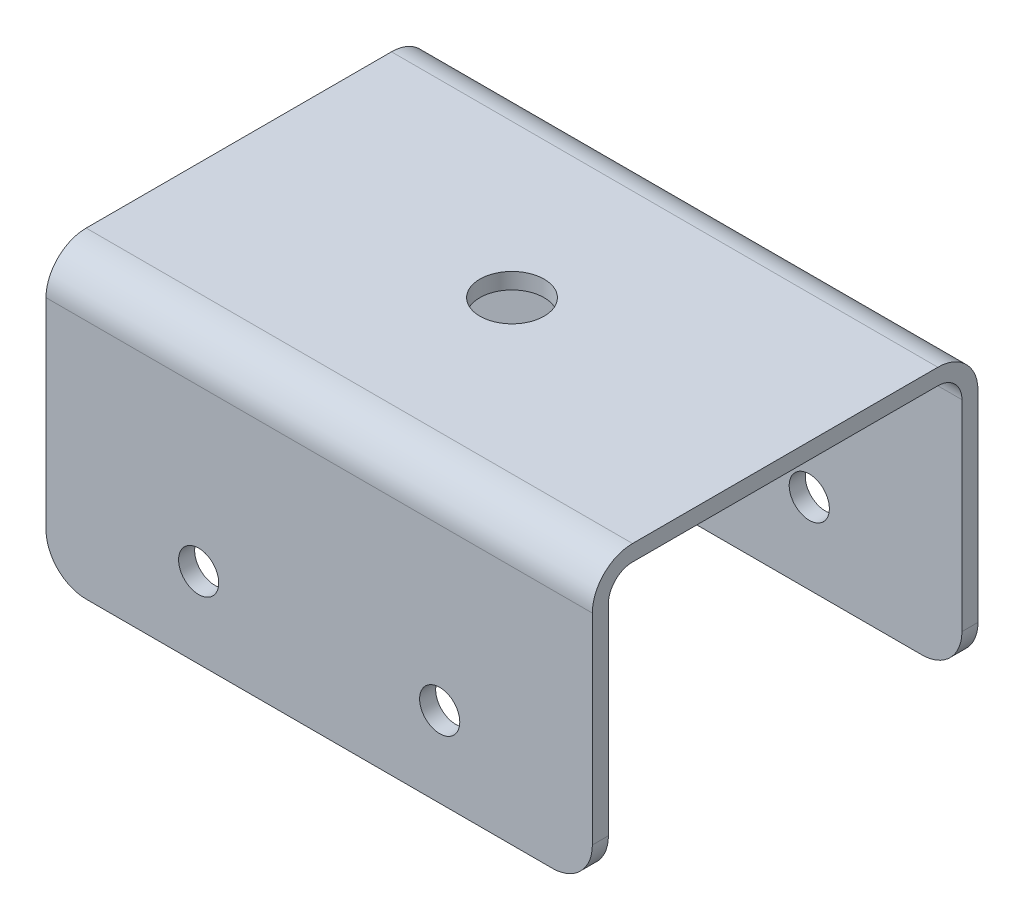
ISO-10303-21;
HEADER;
FILE_DESCRIPTION(('STEP AP214'),'2;1');
FILE_NAME('part.step','',(''),(''),'','','');
FILE_SCHEMA(('AUTOMOTIVE_DESIGN { 1 0 10303 214 1 1 1 1 }'));
ENDSEC;
DATA;
#1=APPLICATION_CONTEXT('core data for automotive mechanical design processes');
#2=APPLICATION_PROTOCOL_DEFINITION('international standard','automotive_design',2000,#1);
#3=PRODUCT_CONTEXT('',#1,'mechanical');
#4=PRODUCT('Part','Part','',(#3));
#5=PRODUCT_RELATED_PRODUCT_CATEGORY('part','',(#4));
#6=PRODUCT_DEFINITION_FORMATION('','',#4);
#7=PRODUCT_DEFINITION_CONTEXT('part definition',#1,'design');
#8=PRODUCT_DEFINITION('design','',#6,#7);
#9=PRODUCT_DEFINITION_SHAPE('','',#8);
#10=(LENGTH_UNIT() NAMED_UNIT(*) SI_UNIT(.MILLI.,.METRE.));
#11=(NAMED_UNIT(*) PLANE_ANGLE_UNIT() SI_UNIT($,.RADIAN.));
#12=(NAMED_UNIT(*) SI_UNIT($,.STERADIAN.) SOLID_ANGLE_UNIT());
#13=UNCERTAINTY_MEASURE_WITH_UNIT(LENGTH_MEASURE(1.E-05),#10,'distance_accuracy_value','');
#14=(GEOMETRIC_REPRESENTATION_CONTEXT(3) GLOBAL_UNCERTAINTY_ASSIGNED_CONTEXT((#13)) GLOBAL_UNIT_ASSIGNED_CONTEXT((#10,
#11,#12)) REPRESENTATION_CONTEXT('',''));
#15=CARTESIAN_POINT('',(0.,0.,0.));
#16=DIRECTION('',(0.,0.,1.));
#17=DIRECTION('',(1.,0.,0.));
#18=AXIS2_PLACEMENT_3D('',#15,#16,#17);
#19=CARTESIAN_POINT('',(34.,35.,-24.));
#20=DIRECTION('',(-1.,0.,0.));
#21=DIRECTION('',(0.,0.,1.));
#22=AXIS2_PLACEMENT_3D('',#19,#20,#21);
#23=PLANE('',#22);
#24=DIRECTION('',(0.,-1.,0.));
#25=VECTOR('',#24,1.);
#26=CARTESIAN_POINT('',(34.,0.,-22.));
#27=LINE('',#26,#25);
#28=CARTESIAN_POINT('',(34.,30.,-22.));
#29=VERTEX_POINT('',#28);
#30=CARTESIAN_POINT('',(34.,5.,-22.));
#31=VERTEX_POINT('',#30);
#32=EDGE_CURVE('E187',#29,#31,#27,.T.);
#33=ORIENTED_EDGE('',*,*,#32,.T.);
#34=DIRECTION('',(0.,0.,-1.));
#35=VECTOR('',#34,1.);
#36=CARTESIAN_POINT('',(34.,5.,-24.));
#37=LINE('',#36,#35);
#38=CARTESIAN_POINT('',(34.,5.,-24.));
#39=VERTEX_POINT('',#38);
#40=EDGE_CURVE('E257',#31,#39,#37,.T.);
#41=ORIENTED_EDGE('',*,*,#40,.T.);
#42=DIRECTION('',(0.,-1.,0.));
#43=VECTOR('',#42,1.);
#44=CARTESIAN_POINT('',(34.,35.,-24.));
#45=LINE('',#44,#43);
#46=CARTESIAN_POINT('',(34.,30.,-24.));
#47=VERTEX_POINT('',#46);
#48=EDGE_CURVE('E222',#47,#39,#45,.T.);
#49=ORIENTED_EDGE('',*,*,#48,.F.);
#50=CARTESIAN_POINT('',(34.,30.,-19.));
#51=DIRECTION('',(-1.,0.,0.));
#52=DIRECTION('',(0.,0.,1.));
#53=AXIS2_PLACEMENT_3D('',#50,#51,#52);
#54=CIRCLE('',#53,5.);
#55=CARTESIAN_POINT('',(34.,35.,-19.));
#56=VERTEX_POINT('',#55);
#57=EDGE_CURVE('E239',#47,#56,#54,.F.);
#58=ORIENTED_EDGE('',*,*,#57,.T.);
#59=DIRECTION('',(0.,0.,-1.));
#60=VECTOR('',#59,1.);
#61=CARTESIAN_POINT('',(34.,35.,-24.));
#62=LINE('',#61,#60);
#63=CARTESIAN_POINT('',(34.,35.,19.));
#64=VERTEX_POINT('',#63);
#65=EDGE_CURVE('E203',#64,#56,#62,.T.);
#66=ORIENTED_EDGE('',*,*,#65,.F.);
#67=CARTESIAN_POINT('',(34.,30.,19.));
#68=DIRECTION('',(-1.,0.,0.));
#69=DIRECTION('',(0.,0.,1.));
#70=AXIS2_PLACEMENT_3D('',#67,#68,#69);
#71=CIRCLE('',#70,5.);
#72=CARTESIAN_POINT('',(34.,30.,24.));
#73=VERTEX_POINT('',#72);
#74=EDGE_CURVE('E237',#64,#73,#71,.F.);
#75=ORIENTED_EDGE('',*,*,#74,.T.);
#76=DIRECTION('',(0.,-1.,0.));
#77=VECTOR('',#76,1.);
#78=CARTESIAN_POINT('',(34.,35.,24.));
#79=LINE('',#78,#77);
#80=CARTESIAN_POINT('',(34.,5.,24.));
#81=VERTEX_POINT('',#80);
#82=EDGE_CURVE('E210',#73,#81,#79,.T.);
#83=ORIENTED_EDGE('',*,*,#82,.T.);
#84=DIRECTION('',(0.,0.,-1.));
#85=VECTOR('',#84,1.);
#86=CARTESIAN_POINT('',(34.,5.,-24.));
#87=LINE('',#86,#85);
#88=CARTESIAN_POINT('',(34.,5.,22.));
#89=VERTEX_POINT('',#88);
#90=EDGE_CURVE('E247',#81,#89,#87,.T.);
#91=ORIENTED_EDGE('',*,*,#90,.T.);
#92=DIRECTION('',(0.,1.,0.));
#93=VECTOR('',#92,1.);
#94=CARTESIAN_POINT('',(34.,30.,22.));
#95=LINE('',#94,#93);
#96=CARTESIAN_POINT('',(34.,30.,22.));
#97=VERTEX_POINT('',#96);
#98=EDGE_CURVE('E175',#89,#97,#95,.T.);
#99=ORIENTED_EDGE('',*,*,#98,.T.);
#100=CARTESIAN_POINT('',(34.,30.,19.));
#101=DIRECTION('',(-1.,0.,0.));
#102=DIRECTION('',(0.,0.,1.));
#103=AXIS2_PLACEMENT_3D('',#100,#101,#102);
#104=CIRCLE('',#103,3.);
#105=CARTESIAN_POINT('',(34.,33.,19.));
#106=VERTEX_POINT('',#105);
#107=EDGE_CURVE('E155',#97,#106,#104,.T.);
#108=ORIENTED_EDGE('',*,*,#107,.T.);
#109=DIRECTION('',(0.,0.,-1.));
#110=VECTOR('',#109,1.);
#111=CARTESIAN_POINT('',(34.,33.,-19.));
#112=LINE('',#111,#110);
#113=CARTESIAN_POINT('',(34.,33.,-19.));
#114=VERTEX_POINT('',#113);
#115=EDGE_CURVE('E165',#106,#114,#112,.T.);
#116=ORIENTED_EDGE('',*,*,#115,.T.);
#117=CARTESIAN_POINT('',(34.,30.,-19.));
#118=DIRECTION('',(-1.,0.,0.));
#119=DIRECTION('',(0.,0.,1.));
#120=AXIS2_PLACEMENT_3D('',#117,#118,#119);
#121=CIRCLE('',#120,3.);
#122=EDGE_CURVE('E170',#114,#29,#121,.T.);
#123=ORIENTED_EDGE('',*,*,#122,.T.);
#124=EDGE_LOOP('',(#33,#41,#49,#58,#66,#75,#83,#91,#99,#108,#116,#123));
#125=FACE_BOUND('',#124,.T.);
#126=ADVANCED_FACE('F33',(#125),#23,.F.);
#127=CARTESIAN_POINT('',(0.,0.,0.));
#128=DIRECTION('',(0.,1.,0.));
#129=DIRECTION('',(0.,0.,1.));
#130=AXIS2_PLACEMENT_3D('',#127,#128,#129);
#131=PLANE('',#130);
#132=DIRECTION('',(-1.,0.,0.));
#133=VECTOR('',#132,1.);
#134=CARTESIAN_POINT('',(-34.,0.,-24.));
#135=LINE('',#134,#133);
#136=CARTESIAN_POINT('',(29.,0.,-24.));
#137=VERTEX_POINT('',#136);
#138=CARTESIAN_POINT('',(-29.,0.,-24.));
#139=VERTEX_POINT('',#138);
#140=EDGE_CURVE('E200',#137,#139,#135,.T.);
#141=ORIENTED_EDGE('',*,*,#140,.F.);
#142=DIRECTION('',(0.,0.,-1.));
#143=VECTOR('',#142,1.);
#144=CARTESIAN_POINT('',(29.,0.,0.));
#145=LINE('',#144,#143);
#146=CARTESIAN_POINT('',(29.,0.,-22.));
#147=VERTEX_POINT('',#146);
#148=EDGE_CURVE('E266',#137,#147,#145,.F.);
#149=ORIENTED_EDGE('',*,*,#148,.T.);
#150=DIRECTION('',(-1.,0.,0.));
#151=VECTOR('',#150,1.);
#152=CARTESIAN_POINT('',(-34.,0.,-22.));
#153=LINE('',#152,#151);
#154=CARTESIAN_POINT('',(-29.,0.,-22.));
#155=VERTEX_POINT('',#154);
#156=EDGE_CURVE('E190',#147,#155,#153,.T.);
#157=ORIENTED_EDGE('',*,*,#156,.T.);
#158=DIRECTION('',(0.,0.,1.));
#159=VECTOR('',#158,1.);
#160=CARTESIAN_POINT('',(-29.,0.,0.));
#161=LINE('',#160,#159);
#162=EDGE_CURVE('E264',#155,#139,#161,.F.);
#163=ORIENTED_EDGE('',*,*,#162,.T.);
#164=EDGE_LOOP('',(#141,#149,#157,#163));
#165=FACE_BOUND('',#164,.T.);
#166=ADVANCED_FACE('F328',(#165),#131,.F.);
#167=DIRECTION('',(1.,0.,0.));
#168=VECTOR('',#167,1.);
#169=CARTESIAN_POINT('',(-34.,0.,22.));
#170=LINE('',#169,#168);
#171=CARTESIAN_POINT('',(-29.,0.,22.));
#172=VERTEX_POINT('',#171);
#173=CARTESIAN_POINT('',(29.,0.,22.));
#174=VERTEX_POINT('',#173);
#175=EDGE_CURVE('E198',#172,#174,#170,.T.);
#176=ORIENTED_EDGE('',*,*,#175,.T.);
#177=DIRECTION('',(0.,0.,-1.));
#178=VECTOR('',#177,1.);
#179=CARTESIAN_POINT('',(29.,0.,0.));
#180=LINE('',#179,#178);
#181=CARTESIAN_POINT('',(29.,0.,24.));
#182=VERTEX_POINT('',#181);
#183=EDGE_CURVE('E57',#174,#182,#180,.F.);
#184=ORIENTED_EDGE('',*,*,#183,.T.);
#185=DIRECTION('',(1.,0.,0.));
#186=VECTOR('',#185,1.);
#187=CARTESIAN_POINT('',(-34.,0.,24.));
#188=LINE('',#187,#186);
#189=CARTESIAN_POINT('',(-29.,0.,24.));
#190=VERTEX_POINT('',#189);
#191=EDGE_CURVE('E207',#190,#182,#188,.T.);
#192=ORIENTED_EDGE('',*,*,#191,.F.);
#193=DIRECTION('',(0.,0.,1.));
#194=VECTOR('',#193,1.);
#195=CARTESIAN_POINT('',(-29.,0.,0.));
#196=LINE('',#195,#194);
#197=EDGE_CURVE('E276',#190,#172,#196,.F.);
#198=ORIENTED_EDGE('',*,*,#197,.T.);
#199=EDGE_LOOP('',(#176,#184,#192,#198));
#200=FACE_BOUND('',#199,.T.);
#201=ADVANCED_FACE('F330',(#200),#131,.F.);
#202=CARTESIAN_POINT('',(-34.,35.,-24.));
#203=DIRECTION('',(0.,0.,1.));
#204=DIRECTION('',(1.,0.,0.));
#205=AXIS2_PLACEMENT_3D('',#202,#203,#204);
#206=PLANE('',#205);
#207=CARTESIAN_POINT('',(-15.,10.,-24.));
#208=DIRECTION('',(0.,0.,1.));
#209=DIRECTION('',(1.,0.,0.));
#210=AXIS2_PLACEMENT_3D('',#207,#208,#209);
#211=CIRCLE('',#210,2.5);
#212=CARTESIAN_POINT('',(-12.5,10.,-24.));
#213=VERTEX_POINT('',#212);
#214=EDGE_CURVE('E252',#213,#213,#211,.T.);
#215=ORIENTED_EDGE('',*,*,#214,.T.);
#216=EDGE_LOOP('',(#215));
#217=FACE_BOUND('',#216,.T.);
#218=CARTESIAN_POINT('',(15.,10.,-24.));
#219=DIRECTION('',(0.,0.,1.));
#220=DIRECTION('',(1.,0.,0.));
#221=AXIS2_PLACEMENT_3D('',#218,#219,#220);
#222=CIRCLE('',#221,2.5);
#223=CARTESIAN_POINT('',(17.5,10.,-24.));
#224=VERTEX_POINT('',#223);
#225=EDGE_CURVE('E416',#224,#224,#222,.T.);
#226=ORIENTED_EDGE('',*,*,#225,.T.);
#227=EDGE_LOOP('',(#226));
#228=FACE_BOUND('',#227,.T.);
#229=ORIENTED_EDGE('',*,*,#48,.T.);
#230=CARTESIAN_POINT('',(29.,5.,-24.));
#231=DIRECTION('',(0.,0.,1.));
#232=DIRECTION('',(1.,0.,0.));
#233=AXIS2_PLACEMENT_3D('',#230,#231,#232);
#234=CIRCLE('',#233,5.);
#235=EDGE_CURVE('E262',#39,#137,#234,.F.);
#236=ORIENTED_EDGE('',*,*,#235,.T.);
#237=ORIENTED_EDGE('',*,*,#140,.T.);
#238=CARTESIAN_POINT('',(-29.,5.,-24.));
#239=DIRECTION('',(0.,0.,1.));
#240=DIRECTION('',(1.,0.,0.));
#241=AXIS2_PLACEMENT_3D('',#238,#239,#240);
#242=CIRCLE('',#241,5.);
#243=CARTESIAN_POINT('',(-34.,5.,-24.));
#244=VERTEX_POINT('',#243);
#245=EDGE_CURVE('E260',#139,#244,#242,.F.);
#246=ORIENTED_EDGE('',*,*,#245,.T.);
#247=DIRECTION('',(0.,-1.,0.));
#248=VECTOR('',#247,1.);
#249=CARTESIAN_POINT('',(-34.,35.,-24.));
#250=LINE('',#249,#248);
#251=CARTESIAN_POINT('',(-34.,30.,-24.));
#252=VERTEX_POINT('',#251);
#253=EDGE_CURVE('E219',#252,#244,#250,.T.);
#254=ORIENTED_EDGE('',*,*,#253,.F.);
#255=DIRECTION('',(-1.,0.,0.));
#256=VECTOR('',#255,1.);
#257=CARTESIAN_POINT('',(34.,30.,-24.));
#258=LINE('',#257,#256);
#259=EDGE_CURVE('E235',#252,#47,#258,.F.);
#260=ORIENTED_EDGE('',*,*,#259,.T.);
#261=EDGE_LOOP('',(#229,#236,#237,#246,#254,#260));
#262=FACE_BOUND('',#261,.T.);
#263=ADVANCED_FACE('F307',(#217,#228,#262),#206,.F.);
#264=CARTESIAN_POINT('',(-34.,35.,-24.));
#265=DIRECTION('',(1.,0.,0.));
#266=DIRECTION('',(0.,0.,-1.));
#267=AXIS2_PLACEMENT_3D('',#264,#265,#266);
#268=PLANE('',#267);
#269=ORIENTED_EDGE('',*,*,#253,.T.);
#270=DIRECTION('',(0.,0.,1.));
#271=VECTOR('',#270,1.);
#272=CARTESIAN_POINT('',(-34.,5.,-24.));
#273=LINE('',#272,#271);
#274=CARTESIAN_POINT('',(-34.,5.,-22.));
#275=VERTEX_POINT('',#274);
#276=EDGE_CURVE('E11',#244,#275,#273,.T.);
#277=ORIENTED_EDGE('',*,*,#276,.T.);
#278=DIRECTION('',(0.,-1.,0.));
#279=VECTOR('',#278,1.);
#280=CARTESIAN_POINT('',(-34.,0.,-22.));
#281=LINE('',#280,#279);
#282=CARTESIAN_POINT('',(-34.,30.,-22.));
#283=VERTEX_POINT('',#282);
#284=EDGE_CURVE('E177',#283,#275,#281,.T.);
#285=ORIENTED_EDGE('',*,*,#284,.F.);
#286=CARTESIAN_POINT('',(-34.,30.,-19.));
#287=DIRECTION('',(1.,0.,0.));
#288=DIRECTION('',(0.,0.,-1.));
#289=AXIS2_PLACEMENT_3D('',#286,#287,#288);
#290=CIRCLE('',#289,3.);
#291=CARTESIAN_POINT('',(-34.,33.,-19.));
#292=VERTEX_POINT('',#291);
#293=EDGE_CURVE('E191',#292,#283,#290,.F.);
#294=ORIENTED_EDGE('',*,*,#293,.F.);
#295=DIRECTION('',(0.,0.,-1.));
#296=VECTOR('',#295,1.);
#297=CARTESIAN_POINT('',(-34.,33.,-19.));
#298=LINE('',#297,#296);
#299=CARTESIAN_POINT('',(-34.,33.,19.));
#300=VERTEX_POINT('',#299);
#301=EDGE_CURVE('E194',#300,#292,#298,.T.);
#302=ORIENTED_EDGE('',*,*,#301,.F.);
#303=CARTESIAN_POINT('',(-34.,30.,19.));
#304=DIRECTION('',(1.,0.,0.));
#305=DIRECTION('',(0.,0.,-1.));
#306=AXIS2_PLACEMENT_3D('',#303,#304,#305);
#307=CIRCLE('',#306,3.);
#308=CARTESIAN_POINT('',(-34.,30.,22.));
#309=VERTEX_POINT('',#308);
#310=EDGE_CURVE('E157',#309,#300,#307,.F.);
#311=ORIENTED_EDGE('',*,*,#310,.F.);
#312=DIRECTION('',(0.,1.,0.));
#313=VECTOR('',#312,1.);
#314=CARTESIAN_POINT('',(-34.,30.,22.));
#315=LINE('',#314,#313);
#316=CARTESIAN_POINT('',(-34.,5.,22.));
#317=VERTEX_POINT('',#316);
#318=EDGE_CURVE('E180',#317,#309,#315,.T.);
#319=ORIENTED_EDGE('',*,*,#318,.F.);
#320=DIRECTION('',(0.,0.,1.));
#321=VECTOR('',#320,1.);
#322=CARTESIAN_POINT('',(-34.,5.,-24.));
#323=LINE('',#322,#321);
#324=CARTESIAN_POINT('',(-34.,5.,24.));
#325=VERTEX_POINT('',#324);
#326=EDGE_CURVE('E42',#317,#325,#323,.T.);
#327=ORIENTED_EDGE('',*,*,#326,.T.);
#328=DIRECTION('',(0.,-1.,0.));
#329=VECTOR('',#328,1.);
#330=CARTESIAN_POINT('',(-34.,35.,24.));
#331=LINE('',#330,#329);
#332=CARTESIAN_POINT('',(-34.,30.,24.));
#333=VERTEX_POINT('',#332);
#334=EDGE_CURVE('E216',#333,#325,#331,.T.);
#335=ORIENTED_EDGE('',*,*,#334,.F.);
#336=CARTESIAN_POINT('',(-34.,30.,19.));
#337=DIRECTION('',(1.,0.,0.));
#338=DIRECTION('',(0.,0.,-1.));
#339=AXIS2_PLACEMENT_3D('',#336,#337,#338);
#340=CIRCLE('',#339,5.);
#341=CARTESIAN_POINT('',(-34.,35.,19.));
#342=VERTEX_POINT('',#341);
#343=EDGE_CURVE('E231',#333,#342,#340,.F.);
#344=ORIENTED_EDGE('',*,*,#343,.T.);
#345=DIRECTION('',(0.,0.,1.));
#346=VECTOR('',#345,1.);
#347=CARTESIAN_POINT('',(-34.,35.,-24.));
#348=LINE('',#347,#346);
#349=CARTESIAN_POINT('',(-34.,35.,-19.));
#350=VERTEX_POINT('',#349);
#351=EDGE_CURVE('E206',#350,#342,#348,.T.);
#352=ORIENTED_EDGE('',*,*,#351,.F.);
#353=CARTESIAN_POINT('',(-34.,30.,-19.));
#354=DIRECTION('',(1.,0.,0.));
#355=DIRECTION('',(0.,0.,-1.));
#356=AXIS2_PLACEMENT_3D('',#353,#354,#355);
#357=CIRCLE('',#356,5.);
#358=EDGE_CURVE('E233',#350,#252,#357,.F.);
#359=ORIENTED_EDGE('',*,*,#358,.T.);
#360=EDGE_LOOP('',(#269,#277,#285,#294,#302,#311,#319,#327,#335,#344,#352,#359));
#361=FACE_BOUND('',#360,.T.);
#362=ADVANCED_FACE('F285',(#361),#268,.F.);
#363=CARTESIAN_POINT('',(-34.,35.,24.));
#364=DIRECTION('',(0.,0.,-1.));
#365=DIRECTION('',(-1.,0.,0.));
#366=AXIS2_PLACEMENT_3D('',#363,#364,#365);
#367=PLANE('',#366);
#368=CARTESIAN_POINT('',(-15.,10.,24.));
#369=DIRECTION('',(0.,0.,1.));
#370=DIRECTION('',(1.,0.,0.));
#371=AXIS2_PLACEMENT_3D('',#368,#369,#370);
#372=CIRCLE('',#371,2.5);
#373=CARTESIAN_POINT('',(-12.5,10.,24.));
#374=VERTEX_POINT('',#373);
#375=EDGE_CURVE('E413',#374,#374,#372,.T.);
#376=ORIENTED_EDGE('',*,*,#375,.F.);
#377=EDGE_LOOP('',(#376));
#378=FACE_BOUND('',#377,.T.);
#379=CARTESIAN_POINT('',(15.,10.,24.));
#380=DIRECTION('',(0.,0.,1.));
#381=DIRECTION('',(1.,0.,0.));
#382=AXIS2_PLACEMENT_3D('',#379,#380,#381);
#383=CIRCLE('',#382,2.5);
#384=CARTESIAN_POINT('',(17.5,10.,24.));
#385=VERTEX_POINT('',#384);
#386=EDGE_CURVE('E420',#385,#385,#383,.T.);
#387=ORIENTED_EDGE('',*,*,#386,.F.);
#388=EDGE_LOOP('',(#387));
#389=FACE_BOUND('',#388,.T.);
#390=ORIENTED_EDGE('',*,*,#191,.T.);
#391=CARTESIAN_POINT('',(29.,5.,24.));
#392=DIRECTION('',(0.,0.,-1.));
#393=DIRECTION('',(-1.,0.,0.));
#394=AXIS2_PLACEMENT_3D('',#391,#392,#393);
#395=CIRCLE('',#394,5.);
#396=EDGE_CURVE('E280',#182,#81,#395,.F.);
#397=ORIENTED_EDGE('',*,*,#396,.T.);
#398=ORIENTED_EDGE('',*,*,#82,.F.);
#399=DIRECTION('',(1.,0.,0.));
#400=VECTOR('',#399,1.);
#401=CARTESIAN_POINT('',(-34.,30.,24.));
#402=LINE('',#401,#400);
#403=EDGE_CURVE('E241',#73,#333,#402,.F.);
#404=ORIENTED_EDGE('',*,*,#403,.T.);
#405=ORIENTED_EDGE('',*,*,#334,.T.);
#406=CARTESIAN_POINT('',(-29.,5.,24.));
#407=DIRECTION('',(0.,0.,-1.));
#408=DIRECTION('',(-1.,0.,0.));
#409=AXIS2_PLACEMENT_3D('',#406,#407,#408);
#410=CIRCLE('',#409,5.);
#411=EDGE_CURVE('E49',#325,#190,#410,.F.);
#412=ORIENTED_EDGE('',*,*,#411,.T.);
#413=EDGE_LOOP('',(#390,#397,#398,#404,#405,#412));
#414=FACE_BOUND('',#413,.T.);
#415=ADVANCED_FACE('F289',(#378,#389,#414),#367,.F.);
#416=CARTESIAN_POINT('',(0.,35.,0.));
#417=DIRECTION('',(0.,1.,0.));
#418=DIRECTION('',(0.,0.,1.));
#419=AXIS2_PLACEMENT_3D('',#416,#417,#418);
#420=PLANE('',#419);
#421=CARTESIAN_POINT('',(0.,35.,0.));
#422=DIRECTION('',(0.,1.,0.));
#423=DIRECTION('',(0.,0.,1.));
#424=AXIS2_PLACEMENT_3D('',#421,#422,#423);
#425=CIRCLE('',#424,4.);
#426=CARTESIAN_POINT('',(0.,35.,4.));
#427=VERTEX_POINT('',#426);
#428=EDGE_CURVE('E433',#427,#427,#425,.T.);
#429=ORIENTED_EDGE('',*,*,#428,.F.);
#430=EDGE_LOOP('',(#429));
#431=FACE_BOUND('',#430,.T.);
#432=ORIENTED_EDGE('',*,*,#65,.T.);
#433=DIRECTION('',(-1.,0.,0.));
#434=VECTOR('',#433,1.);
#435=CARTESIAN_POINT('',(-34.,35.,-19.));
#436=LINE('',#435,#434);
#437=EDGE_CURVE('E228',#56,#350,#436,.T.);
#438=ORIENTED_EDGE('',*,*,#437,.T.);
#439=ORIENTED_EDGE('',*,*,#351,.T.);
#440=DIRECTION('',(1.,0.,0.));
#441=VECTOR('',#440,1.);
#442=CARTESIAN_POINT('',(34.,35.,19.));
#443=LINE('',#442,#441);
#444=EDGE_CURVE('E225',#342,#64,#443,.T.);
#445=ORIENTED_EDGE('',*,*,#444,.T.);
#446=EDGE_LOOP('',(#432,#438,#439,#445));
#447=FACE_BOUND('',#446,.T.);
#448=ADVANCED_FACE('F297',(#431,#447),#420,.T.);
#449=CARTESIAN_POINT('',(-34.,35.,-22.));
#450=DIRECTION('',(0.,0.,1.));
#451=DIRECTION('',(1.,0.,0.));
#452=AXIS2_PLACEMENT_3D('',#449,#450,#451);
#453=PLANE('',#452);
#454=CARTESIAN_POINT('',(-15.,10.,-22.));
#455=DIRECTION('',(0.,0.,1.));
#456=DIRECTION('',(1.,0.,0.));
#457=AXIS2_PLACEMENT_3D('',#454,#455,#456);
#458=CIRCLE('',#457,2.5);
#459=CARTESIAN_POINT('',(-12.5,10.,-22.));
#460=VERTEX_POINT('',#459);
#461=EDGE_CURVE('E183',#460,#460,#458,.T.);
#462=ORIENTED_EDGE('',*,*,#461,.F.);
#463=EDGE_LOOP('',(#462));
#464=FACE_BOUND('',#463,.T.);
#465=CARTESIAN_POINT('',(15.,10.,-22.));
#466=DIRECTION('',(0.,0.,1.));
#467=DIRECTION('',(1.,0.,0.));
#468=AXIS2_PLACEMENT_3D('',#465,#466,#467);
#469=CIRCLE('',#468,2.5);
#470=CARTESIAN_POINT('',(17.5,10.,-22.));
#471=VERTEX_POINT('',#470);
#472=EDGE_CURVE('E251',#471,#471,#469,.T.);
#473=ORIENTED_EDGE('',*,*,#472,.F.);
#474=EDGE_LOOP('',(#473));
#475=FACE_BOUND('',#474,.T.);
#476=ORIENTED_EDGE('',*,*,#156,.F.);
#477=CARTESIAN_POINT('',(29.,5.,-22.));
#478=DIRECTION('',(0.,0.,1.));
#479=DIRECTION('',(1.,0.,0.));
#480=AXIS2_PLACEMENT_3D('',#477,#478,#479);
#481=CIRCLE('',#480,5.);
#482=EDGE_CURVE('E270',#147,#31,#481,.T.);
#483=ORIENTED_EDGE('',*,*,#482,.T.);
#484=ORIENTED_EDGE('',*,*,#32,.F.);
#485=DIRECTION('',(-1.,0.,0.));
#486=VECTOR('',#485,1.);
#487=CARTESIAN_POINT('',(-34.,30.,-22.));
#488=LINE('',#487,#486);
#489=EDGE_CURVE('E162',#29,#283,#488,.T.);
#490=ORIENTED_EDGE('',*,*,#489,.T.);
#491=ORIENTED_EDGE('',*,*,#284,.T.);
#492=CARTESIAN_POINT('',(-29.,5.,-22.));
#493=DIRECTION('',(0.,0.,1.));
#494=DIRECTION('',(1.,0.,0.));
#495=AXIS2_PLACEMENT_3D('',#492,#493,#494);
#496=CIRCLE('',#495,5.);
#497=EDGE_CURVE('E268',#275,#155,#496,.T.);
#498=ORIENTED_EDGE('',*,*,#497,.T.);
#499=EDGE_LOOP('',(#476,#483,#484,#490,#491,#498));
#500=FACE_BOUND('',#499,.T.);
#501=ADVANCED_FACE('F318',(#464,#475,#500),#453,.T.);
#502=CARTESIAN_POINT('',(-34.,35.,22.));
#503=DIRECTION('',(0.,0.,-1.));
#504=DIRECTION('',(-1.,0.,0.));
#505=AXIS2_PLACEMENT_3D('',#502,#503,#504);
#506=PLANE('',#505);
#507=CARTESIAN_POINT('',(-15.,10.,22.));
#508=DIRECTION('',(0.,0.,-1.));
#509=DIRECTION('',(-1.,0.,0.));
#510=AXIS2_PLACEMENT_3D('',#507,#508,#509);
#511=CIRCLE('',#510,2.5);
#512=CARTESIAN_POINT('',(-12.5,10.,22.));
#513=VERTEX_POINT('',#512);
#514=EDGE_CURVE('E253',#513,#513,#511,.T.);
#515=ORIENTED_EDGE('',*,*,#514,.F.);
#516=EDGE_LOOP('',(#515));
#517=FACE_BOUND('',#516,.T.);
#518=CARTESIAN_POINT('',(15.,10.,22.));
#519=DIRECTION('',(0.,0.,-1.));
#520=DIRECTION('',(-1.,0.,0.));
#521=AXIS2_PLACEMENT_3D('',#518,#519,#520);
#522=CIRCLE('',#521,2.5);
#523=CARTESIAN_POINT('',(17.5,10.,22.));
#524=VERTEX_POINT('',#523);
#525=EDGE_CURVE('E248',#524,#524,#522,.T.);
#526=ORIENTED_EDGE('',*,*,#525,.F.);
#527=EDGE_LOOP('',(#526));
#528=FACE_BOUND('',#527,.T.);
#529=ORIENTED_EDGE('',*,*,#98,.F.);
#530=CARTESIAN_POINT('',(29.,5.,22.));
#531=DIRECTION('',(0.,0.,-1.));
#532=DIRECTION('',(-1.,0.,0.));
#533=AXIS2_PLACEMENT_3D('',#530,#531,#532);
#534=CIRCLE('',#533,5.);
#535=EDGE_CURVE('E274',#89,#174,#534,.T.);
#536=ORIENTED_EDGE('',*,*,#535,.T.);
#537=ORIENTED_EDGE('',*,*,#175,.F.);
#538=CARTESIAN_POINT('',(-29.,5.,22.));
#539=DIRECTION('',(0.,0.,-1.));
#540=DIRECTION('',(-1.,0.,0.));
#541=AXIS2_PLACEMENT_3D('',#538,#539,#540);
#542=CIRCLE('',#541,5.);
#543=EDGE_CURVE('E272',#172,#317,#542,.T.);
#544=ORIENTED_EDGE('',*,*,#543,.T.);
#545=ORIENTED_EDGE('',*,*,#318,.T.);
#546=DIRECTION('',(1.,0.,0.));
#547=VECTOR('',#546,1.);
#548=CARTESIAN_POINT('',(-34.,30.,22.));
#549=LINE('',#548,#547);
#550=EDGE_CURVE('E245',#309,#97,#549,.T.);
#551=ORIENTED_EDGE('',*,*,#550,.T.);
#552=EDGE_LOOP('',(#529,#536,#537,#544,#545,#551));
#553=FACE_BOUND('',#552,.T.);
#554=ADVANCED_FACE('F375',(#517,#528,#553),#506,.T.);
#555=CARTESIAN_POINT('',(0.,33.,0.));
#556=DIRECTION('',(0.,1.,0.));
#557=DIRECTION('',(0.,0.,1.));
#558=AXIS2_PLACEMENT_3D('',#555,#556,#557);
#559=PLANE('',#558);
#560=CARTESIAN_POINT('',(0.,33.,0.));
#561=DIRECTION('',(0.,1.,0.));
#562=DIRECTION('',(0.,0.,1.));
#563=AXIS2_PLACEMENT_3D('',#560,#561,#562);
#564=CIRCLE('',#563,4.);
#565=CARTESIAN_POINT('',(0.,33.,4.));
#566=VERTEX_POINT('',#565);
#567=EDGE_CURVE('E37',#566,#566,#564,.T.);
#568=ORIENTED_EDGE('',*,*,#567,.T.);
#569=EDGE_LOOP('',(#568));
#570=FACE_BOUND('',#569,.T.);
#571=DIRECTION('',(1.,0.,0.));
#572=VECTOR('',#571,1.);
#573=CARTESIAN_POINT('',(0.,33.,19.));
#574=LINE('',#573,#572);
#575=EDGE_CURVE('E150',#106,#300,#574,.F.);
#576=ORIENTED_EDGE('',*,*,#575,.T.);
#577=ORIENTED_EDGE('',*,*,#301,.T.);
#578=DIRECTION('',(-1.,0.,0.));
#579=VECTOR('',#578,1.);
#580=CARTESIAN_POINT('',(0.,33.,-19.));
#581=LINE('',#580,#579);
#582=EDGE_CURVE('E161',#292,#114,#581,.F.);
#583=ORIENTED_EDGE('',*,*,#582,.T.);
#584=ORIENTED_EDGE('',*,*,#115,.F.);
#585=EDGE_LOOP('',(#576,#577,#583,#584));
#586=FACE_BOUND('',#585,.T.);
#587=ADVANCED_FACE('F166',(#570,#586),#559,.F.);
#588=CARTESIAN_POINT('',(0.,30.,-19.));
#589=DIRECTION('',(1.,0.,0.));
#590=DIRECTION('',(0.,0.,-1.));
#591=AXIS2_PLACEMENT_3D('',#588,#589,#590);
#592=CYLINDRICAL_SURFACE('',#591,5.);
#593=ORIENTED_EDGE('',*,*,#57,.F.);
#594=ORIENTED_EDGE('',*,*,#259,.F.);
#595=ORIENTED_EDGE('',*,*,#358,.F.);
#596=ORIENTED_EDGE('',*,*,#437,.F.);
#597=EDGE_LOOP('',(#593,#594,#595,#596));
#598=FACE_BOUND('',#597,.T.);
#599=ADVANCED_FACE('F302',(#598),#592,.T.);
#600=CARTESIAN_POINT('',(0.,30.,19.));
#601=DIRECTION('',(-1.,0.,0.));
#602=DIRECTION('',(0.,0.,1.));
#603=AXIS2_PLACEMENT_3D('',#600,#601,#602);
#604=CYLINDRICAL_SURFACE('',#603,5.);
#605=ORIENTED_EDGE('',*,*,#343,.F.);
#606=ORIENTED_EDGE('',*,*,#403,.F.);
#607=ORIENTED_EDGE('',*,*,#74,.F.);
#608=ORIENTED_EDGE('',*,*,#444,.F.);
#609=EDGE_LOOP('',(#605,#606,#607,#608));
#610=FACE_BOUND('',#609,.T.);
#611=ADVANCED_FACE('F293',(#610),#604,.T.);
#612=CARTESIAN_POINT('',(-34.,30.,-19.));
#613=DIRECTION('',(-1.,0.,0.));
#614=DIRECTION('',(0.,0.,1.));
#615=AXIS2_PLACEMENT_3D('',#612,#613,#614);
#616=CYLINDRICAL_SURFACE('',#615,3.);
#617=ORIENTED_EDGE('',*,*,#489,.F.);
#618=ORIENTED_EDGE('',*,*,#122,.F.);
#619=ORIENTED_EDGE('',*,*,#582,.F.);
#620=ORIENTED_EDGE('',*,*,#293,.T.);
#621=EDGE_LOOP('',(#617,#618,#619,#620));
#622=FACE_BOUND('',#621,.T.);
#623=ADVANCED_FACE('F321',(#622),#616,.F.);
#624=CARTESIAN_POINT('',(-34.,30.,19.));
#625=DIRECTION('',(1.,0.,0.));
#626=DIRECTION('',(0.,0.,-1.));
#627=AXIS2_PLACEMENT_3D('',#624,#625,#626);
#628=CYLINDRICAL_SURFACE('',#627,3.);
#629=ORIENTED_EDGE('',*,*,#550,.F.);
#630=ORIENTED_EDGE('',*,*,#310,.T.);
#631=ORIENTED_EDGE('',*,*,#575,.F.);
#632=ORIENTED_EDGE('',*,*,#107,.F.);
#633=EDGE_LOOP('',(#629,#630,#631,#632));
#634=FACE_BOUND('',#633,.T.);
#635=ADVANCED_FACE('F153',(#634),#628,.F.);
#636=CARTESIAN_POINT('',(15.,10.,-24.));
#637=DIRECTION('',(0.,0.,1.));
#638=DIRECTION('',(1.,0.,0.));
#639=AXIS2_PLACEMENT_3D('',#636,#637,#638);
#640=CYLINDRICAL_SURFACE('',#639,2.5);
#641=CARTESIAN_POINT('',(17.5,10.,22.));
#642=CARTESIAN_POINT('',(17.5,10.,22.0208333333333));
#643=CARTESIAN_POINT('',(17.5,10.,22.0416666666667));
#644=CARTESIAN_POINT('',(17.5,10.,22.0833333333333));
#645=CARTESIAN_POINT('',(17.5,10.,22.1041666666667));
#646=CARTESIAN_POINT('',(17.5,10.,22.1458333333333));
#647=CARTESIAN_POINT('',(17.5,10.,22.1666666666667));
#648=CARTESIAN_POINT('',(17.5,10.,22.2083333333333));
#649=CARTESIAN_POINT('',(17.5,10.,22.2291666666667));
#650=CARTESIAN_POINT('',(17.5,10.,22.2708333333333));
#651=CARTESIAN_POINT('',(17.5,10.,22.2916666666667));
#652=CARTESIAN_POINT('',(17.5,10.,22.3333333333333));
#653=CARTESIAN_POINT('',(17.5,10.,22.3541666666667));
#654=CARTESIAN_POINT('',(17.5,10.,22.3958333333333));
#655=CARTESIAN_POINT('',(17.5,10.,22.4166666666667));
#656=CARTESIAN_POINT('',(17.5,10.,22.4583333333333));
#657=CARTESIAN_POINT('',(17.5,10.,22.4791666666667));
#658=CARTESIAN_POINT('',(17.5,10.,22.5208333333333));
#659=CARTESIAN_POINT('',(17.5,10.,22.5416666666667));
#660=CARTESIAN_POINT('',(17.5,10.,22.5833333333333));
#661=CARTESIAN_POINT('',(17.5,10.,22.6041666666667));
#662=CARTESIAN_POINT('',(17.5,10.,22.6458333333333));
#663=CARTESIAN_POINT('',(17.5,10.,22.6666666666667));
#664=CARTESIAN_POINT('',(17.5,10.,22.7083333333333));
#665=CARTESIAN_POINT('',(17.5,10.,22.7291666666667));
#666=CARTESIAN_POINT('',(17.5,10.,22.7708333333333));
#667=CARTESIAN_POINT('',(17.5,10.,22.7916666666667));
#668=CARTESIAN_POINT('',(17.5,10.,22.8333333333333));
#669=CARTESIAN_POINT('',(17.5,10.,22.8541666666667));
#670=CARTESIAN_POINT('',(17.5,10.,22.8958333333333));
#671=CARTESIAN_POINT('',(17.5,10.,22.9166666666667));
#672=CARTESIAN_POINT('',(17.5,10.,22.9583333333333));
#673=CARTESIAN_POINT('',(17.5,10.,22.9791666666667));
#674=CARTESIAN_POINT('',(17.5,10.,23.0208333333333));
#675=CARTESIAN_POINT('',(17.5,10.,23.0416666666667));
#676=CARTESIAN_POINT('',(17.5,10.,23.0833333333333));
#677=CARTESIAN_POINT('',(17.5,10.,23.1041666666667));
#678=CARTESIAN_POINT('',(17.5,10.,23.1458333333333));
#679=CARTESIAN_POINT('',(17.5,10.,23.1666666666667));
#680=CARTESIAN_POINT('',(17.5,10.,23.2083333333333));
#681=CARTESIAN_POINT('',(17.5,10.,23.2291666666667));
#682=CARTESIAN_POINT('',(17.5,10.,23.2708333333333));
#683=CARTESIAN_POINT('',(17.5,10.,23.2916666666667));
#684=CARTESIAN_POINT('',(17.5,10.,23.3333333333333));
#685=CARTESIAN_POINT('',(17.5,10.,23.3541666666667));
#686=CARTESIAN_POINT('',(17.5,10.,23.3958333333333));
#687=CARTESIAN_POINT('',(17.5,10.,23.4166666666667));
#688=CARTESIAN_POINT('',(17.5,10.,23.4583333333333));
#689=CARTESIAN_POINT('',(17.5,10.,23.4791666666667));
#690=CARTESIAN_POINT('',(17.5,10.,23.5208333333333));
#691=CARTESIAN_POINT('',(17.5,10.,23.5416666666667));
#692=CARTESIAN_POINT('',(17.5,10.,23.5833333333333));
#693=CARTESIAN_POINT('',(17.5,10.,23.6041666666667));
#694=CARTESIAN_POINT('',(17.5,10.,23.6458333333333));
#695=CARTESIAN_POINT('',(17.5,10.,23.6666666666667));
#696=CARTESIAN_POINT('',(17.5,10.,23.7083333333333));
#697=CARTESIAN_POINT('',(17.5,10.,23.7291666666667));
#698=CARTESIAN_POINT('',(17.5,10.,23.7708333333333));
#699=CARTESIAN_POINT('',(17.5,10.,23.7916666666667));
#700=CARTESIAN_POINT('',(17.5,10.,23.8333333333333));
#701=CARTESIAN_POINT('',(17.5,10.,23.8541666666667));
#702=CARTESIAN_POINT('',(17.5,10.,23.8958333333333));
#703=CARTESIAN_POINT('',(17.5,10.,23.9166666666667));
#704=CARTESIAN_POINT('',(17.5,10.,23.9583333333333));
#705=CARTESIAN_POINT('',(17.5,10.,23.9791666666667));
#706=CARTESIAN_POINT('',(17.5,10.,24.));
#707=B_SPLINE_CURVE_WITH_KNOTS('',3,(#641,#642,#643,#644,#645,#646,#647,#648,#649,#650,#651,
#652,#653,#654,#655,#656,#657,#658,#659,#660,#661,#662,#663,#664,#665,#666,#667,#668,#669,#670,
#671,#672,#673,#674,#675,#676,#677,#678,#679,#680,#681,#682,#683,#684,#685,#686,#687,#688,#689,
#690,#691,#692,#693,#694,#695,#696,#697,#698,#699,#700,#701,#702,#703,#704,#705,#706),
.UNSPECIFIED.,.F.,.F.,(4,2,2,2,2,2,2,2,2,2,2,2,2,2,2,2,2,2,2,2,2,2,2,2,2,2,2,2,2,2,2,2,4),(0.,
0.0625000000000001,0.125,0.1875,0.25,0.3125,0.375,0.4375,0.5,0.562499999999994,
0.624999999999994,0.687499999999994,0.749999999999994,0.812499999999994,0.874999999999994,
0.937499999999994,0.999999999999994,1.06249999999999,1.12499999999999,1.18749999999999,
1.24999999999999,1.31249999999999,1.37499999999999,1.43749999999999,1.49999999999999,
1.56249999999999,1.62499999999999,1.68749999999999,1.74999999999999,1.81249999999999,
1.87499999999999,1.93749999999999,1.99999999999999),.UNSPECIFIED.);
#708=EDGE_CURVE('BSEAM356',#524,#385,#707,.T.);
#709=ORIENTED_EDGE('',*,*,#525,.T.);
#710=ORIENTED_EDGE('',*,*,#386,.T.);
#711=ORIENTED_EDGE('',*,*,#708,.T.);
#712=ORIENTED_EDGE('',*,*,#708,.F.);
#713=EDGE_LOOP('',(#709,#711,#710,#712));
#714=FACE_BOUND('',#713,.T.);
#715=ADVANCED_FACE('F356',(#714),#640,.F.);
#716=CARTESIAN_POINT('',(-15.,10.,-24.));
#717=DIRECTION('',(0.,0.,1.));
#718=DIRECTION('',(1.,0.,0.));
#719=AXIS2_PLACEMENT_3D('',#716,#717,#718);
#720=CYLINDRICAL_SURFACE('',#719,2.5);
#721=CARTESIAN_POINT('',(-12.5,10.,22.));
#722=CARTESIAN_POINT('',(-12.5,10.,22.0208333333333));
#723=CARTESIAN_POINT('',(-12.5,10.,22.0416666666667));
#724=CARTESIAN_POINT('',(-12.5,10.,22.0833333333333));
#725=CARTESIAN_POINT('',(-12.5,10.,22.1041666666667));
#726=CARTESIAN_POINT('',(-12.5,10.,22.1458333333333));
#727=CARTESIAN_POINT('',(-12.5,10.,22.1666666666667));
#728=CARTESIAN_POINT('',(-12.5,10.,22.2083333333333));
#729=CARTESIAN_POINT('',(-12.5,10.,22.2291666666667));
#730=CARTESIAN_POINT('',(-12.5,10.,22.2708333333333));
#731=CARTESIAN_POINT('',(-12.5,10.,22.2916666666667));
#732=CARTESIAN_POINT('',(-12.5,10.,22.3333333333333));
#733=CARTESIAN_POINT('',(-12.5,10.,22.3541666666667));
#734=CARTESIAN_POINT('',(-12.5,10.,22.3958333333333));
#735=CARTESIAN_POINT('',(-12.5,10.,22.4166666666667));
#736=CARTESIAN_POINT('',(-12.5,10.,22.4583333333333));
#737=CARTESIAN_POINT('',(-12.5,10.,22.4791666666667));
#738=CARTESIAN_POINT('',(-12.5,10.,22.5208333333333));
#739=CARTESIAN_POINT('',(-12.5,10.,22.5416666666667));
#740=CARTESIAN_POINT('',(-12.5,10.,22.5833333333333));
#741=CARTESIAN_POINT('',(-12.5,10.,22.6041666666667));
#742=CARTESIAN_POINT('',(-12.5,10.,22.6458333333333));
#743=CARTESIAN_POINT('',(-12.5,10.,22.6666666666667));
#744=CARTESIAN_POINT('',(-12.5,10.,22.7083333333333));
#745=CARTESIAN_POINT('',(-12.5,10.,22.7291666666667));
#746=CARTESIAN_POINT('',(-12.5,10.,22.7708333333333));
#747=CARTESIAN_POINT('',(-12.5,10.,22.7916666666667));
#748=CARTESIAN_POINT('',(-12.5,10.,22.8333333333333));
#749=CARTESIAN_POINT('',(-12.5,10.,22.8541666666667));
#750=CARTESIAN_POINT('',(-12.5,10.,22.8958333333333));
#751=CARTESIAN_POINT('',(-12.5,10.,22.9166666666667));
#752=CARTESIAN_POINT('',(-12.5,10.,22.9583333333333));
#753=CARTESIAN_POINT('',(-12.5,10.,22.9791666666667));
#754=CARTESIAN_POINT('',(-12.5,10.,23.0208333333333));
#755=CARTESIAN_POINT('',(-12.5,10.,23.0416666666667));
#756=CARTESIAN_POINT('',(-12.5,10.,23.0833333333333));
#757=CARTESIAN_POINT('',(-12.5,10.,23.1041666666667));
#758=CARTESIAN_POINT('',(-12.5,10.,23.1458333333333));
#759=CARTESIAN_POINT('',(-12.5,10.,23.1666666666667));
#760=CARTESIAN_POINT('',(-12.5,10.,23.2083333333333));
#761=CARTESIAN_POINT('',(-12.5,10.,23.2291666666667));
#762=CARTESIAN_POINT('',(-12.5,10.,23.2708333333333));
#763=CARTESIAN_POINT('',(-12.5,10.,23.2916666666667));
#764=CARTESIAN_POINT('',(-12.5,10.,23.3333333333333));
#765=CARTESIAN_POINT('',(-12.5,10.,23.3541666666667));
#766=CARTESIAN_POINT('',(-12.5,10.,23.3958333333333));
#767=CARTESIAN_POINT('',(-12.5,10.,23.4166666666667));
#768=CARTESIAN_POINT('',(-12.5,10.,23.4583333333333));
#769=CARTESIAN_POINT('',(-12.5,10.,23.4791666666667));
#770=CARTESIAN_POINT('',(-12.5,10.,23.5208333333333));
#771=CARTESIAN_POINT('',(-12.5,10.,23.5416666666667));
#772=CARTESIAN_POINT('',(-12.5,10.,23.5833333333333));
#773=CARTESIAN_POINT('',(-12.5,10.,23.6041666666667));
#774=CARTESIAN_POINT('',(-12.5,10.,23.6458333333333));
#775=CARTESIAN_POINT('',(-12.5,10.,23.6666666666667));
#776=CARTESIAN_POINT('',(-12.5,10.,23.7083333333333));
#777=CARTESIAN_POINT('',(-12.5,10.,23.7291666666667));
#778=CARTESIAN_POINT('',(-12.5,10.,23.7708333333333));
#779=CARTESIAN_POINT('',(-12.5,10.,23.7916666666667));
#780=CARTESIAN_POINT('',(-12.5,10.,23.8333333333333));
#781=CARTESIAN_POINT('',(-12.5,10.,23.8541666666667));
#782=CARTESIAN_POINT('',(-12.5,10.,23.8958333333333));
#783=CARTESIAN_POINT('',(-12.5,10.,23.9166666666667));
#784=CARTESIAN_POINT('',(-12.5,10.,23.9583333333333));
#785=CARTESIAN_POINT('',(-12.5,10.,23.9791666666667));
#786=CARTESIAN_POINT('',(-12.5,10.,24.));
#787=B_SPLINE_CURVE_WITH_KNOTS('',3,(#721,#722,#723,#724,#725,#726,#727,#728,#729,#730,#731,
#732,#733,#734,#735,#736,#737,#738,#739,#740,#741,#742,#743,#744,#745,#746,#747,#748,#749,#750,
#751,#752,#753,#754,#755,#756,#757,#758,#759,#760,#761,#762,#763,#764,#765,#766,#767,#768,#769,
#770,#771,#772,#773,#774,#775,#776,#777,#778,#779,#780,#781,#782,#783,#784,#785,#786),
.UNSPECIFIED.,.F.,.F.,(4,2,2,2,2,2,2,2,2,2,2,2,2,2,2,2,2,2,2,2,2,2,2,2,2,2,2,2,2,2,2,2,4),(0.,
0.0625000000000001,0.125,0.1875,0.25,0.3125,0.375,0.4375,0.5,0.562499999999994,
0.624999999999994,0.687499999999994,0.749999999999994,0.812499999999994,0.874999999999994,
0.937499999999994,0.999999999999994,1.06249999999999,1.12499999999999,1.18749999999999,
1.24999999999999,1.31249999999999,1.37499999999999,1.43749999999999,1.49999999999999,
1.56249999999999,1.62499999999999,1.68749999999999,1.74999999999999,1.81249999999999,
1.87499999999999,1.93749999999999,1.99999999999999),.UNSPECIFIED.);
#788=EDGE_CURVE('BSEAM394',#513,#374,#787,.T.);
#789=ORIENTED_EDGE('',*,*,#514,.T.);
#790=ORIENTED_EDGE('',*,*,#375,.T.);
#791=ORIENTED_EDGE('',*,*,#788,.T.);
#792=ORIENTED_EDGE('',*,*,#788,.F.);
#793=EDGE_LOOP('',(#789,#791,#790,#792));
#794=FACE_BOUND('',#793,.T.);
#795=ADVANCED_FACE('F394',(#794),#720,.F.);
#796=CARTESIAN_POINT('',(17.5,10.,-22.));
#797=CARTESIAN_POINT('',(17.5,10.,-22.0208333333333));
#798=CARTESIAN_POINT('',(17.5,10.,-22.0416666666667));
#799=CARTESIAN_POINT('',(17.5,10.,-22.0833333333333));
#800=CARTESIAN_POINT('',(17.5,10.,-22.1041666666667));
#801=CARTESIAN_POINT('',(17.5,10.,-22.1458333333333));
#802=CARTESIAN_POINT('',(17.5,10.,-22.1666666666667));
#803=CARTESIAN_POINT('',(17.5,10.,-22.2083333333333));
#804=CARTESIAN_POINT('',(17.5,10.,-22.2291666666667));
#805=CARTESIAN_POINT('',(17.5,10.,-22.2708333333333));
#806=CARTESIAN_POINT('',(17.5,10.,-22.2916666666667));
#807=CARTESIAN_POINT('',(17.5,10.,-22.3333333333333));
#808=CARTESIAN_POINT('',(17.5,10.,-22.3541666666667));
#809=CARTESIAN_POINT('',(17.5,10.,-22.3958333333333));
#810=CARTESIAN_POINT('',(17.5,10.,-22.4166666666667));
#811=CARTESIAN_POINT('',(17.5,10.,-22.4583333333333));
#812=CARTESIAN_POINT('',(17.5,10.,-22.4791666666667));
#813=CARTESIAN_POINT('',(17.5,10.,-22.5208333333333));
#814=CARTESIAN_POINT('',(17.5,10.,-22.5416666666667));
#815=CARTESIAN_POINT('',(17.5,10.,-22.5833333333333));
#816=CARTESIAN_POINT('',(17.5,10.,-22.6041666666667));
#817=CARTESIAN_POINT('',(17.5,10.,-22.6458333333333));
#818=CARTESIAN_POINT('',(17.5,10.,-22.6666666666667));
#819=CARTESIAN_POINT('',(17.5,10.,-22.7083333333333));
#820=CARTESIAN_POINT('',(17.5,10.,-22.7291666666667));
#821=CARTESIAN_POINT('',(17.5,10.,-22.7708333333333));
#822=CARTESIAN_POINT('',(17.5,10.,-22.7916666666667));
#823=CARTESIAN_POINT('',(17.5,10.,-22.8333333333333));
#824=CARTESIAN_POINT('',(17.5,10.,-22.8541666666667));
#825=CARTESIAN_POINT('',(17.5,10.,-22.8958333333333));
#826=CARTESIAN_POINT('',(17.5,10.,-22.9166666666667));
#827=CARTESIAN_POINT('',(17.5,10.,-22.9583333333333));
#828=CARTESIAN_POINT('',(17.5,10.,-22.9791666666667));
#829=CARTESIAN_POINT('',(17.5,10.,-23.0208333333333));
#830=CARTESIAN_POINT('',(17.5,10.,-23.0416666666667));
#831=CARTESIAN_POINT('',(17.5,10.,-23.0833333333333));
#832=CARTESIAN_POINT('',(17.5,10.,-23.1041666666667));
#833=CARTESIAN_POINT('',(17.5,10.,-23.1458333333333));
#834=CARTESIAN_POINT('',(17.5,10.,-23.1666666666667));
#835=CARTESIAN_POINT('',(17.5,10.,-23.2083333333333));
#836=CARTESIAN_POINT('',(17.5,10.,-23.2291666666667));
#837=CARTESIAN_POINT('',(17.5,10.,-23.2708333333333));
#838=CARTESIAN_POINT('',(17.5,10.,-23.2916666666667));
#839=CARTESIAN_POINT('',(17.5,10.,-23.3333333333333));
#840=CARTESIAN_POINT('',(17.5,10.,-23.3541666666667));
#841=CARTESIAN_POINT('',(17.5,10.,-23.3958333333333));
#842=CARTESIAN_POINT('',(17.5,10.,-23.4166666666667));
#843=CARTESIAN_POINT('',(17.5,10.,-23.4583333333333));
#844=CARTESIAN_POINT('',(17.5,10.,-23.4791666666667));
#845=CARTESIAN_POINT('',(17.5,10.,-23.5208333333333));
#846=CARTESIAN_POINT('',(17.5,10.,-23.5416666666667));
#847=CARTESIAN_POINT('',(17.5,10.,-23.5833333333333));
#848=CARTESIAN_POINT('',(17.5,10.,-23.6041666666667));
#849=CARTESIAN_POINT('',(17.5,10.,-23.6458333333333));
#850=CARTESIAN_POINT('',(17.5,10.,-23.6666666666667));
#851=CARTESIAN_POINT('',(17.5,10.,-23.7083333333333));
#852=CARTESIAN_POINT('',(17.5,10.,-23.7291666666667));
#853=CARTESIAN_POINT('',(17.5,10.,-23.7708333333333));
#854=CARTESIAN_POINT('',(17.5,10.,-23.7916666666667));
#855=CARTESIAN_POINT('',(17.5,10.,-23.8333333333333));
#856=CARTESIAN_POINT('',(17.5,10.,-23.8541666666667));
#857=CARTESIAN_POINT('',(17.5,10.,-23.8958333333333));
#858=CARTESIAN_POINT('',(17.5,10.,-23.9166666666667));
#859=CARTESIAN_POINT('',(17.5,10.,-23.9583333333333));
#860=CARTESIAN_POINT('',(17.5,10.,-23.9791666666667));
#861=CARTESIAN_POINT('',(17.5,10.,-24.));
#862=B_SPLINE_CURVE_WITH_KNOTS('',3,(#796,#797,#798,#799,#800,#801,#802,#803,#804,#805,#806,
#807,#808,#809,#810,#811,#812,#813,#814,#815,#816,#817,#818,#819,#820,#821,#822,#823,#824,#825,
#826,#827,#828,#829,#830,#831,#832,#833,#834,#835,#836,#837,#838,#839,#840,#841,#842,#843,#844,
#845,#846,#847,#848,#849,#850,#851,#852,#853,#854,#855,#856,#857,#858,#859,#860,#861),
.UNSPECIFIED.,.F.,.F.,(4,2,2,2,2,2,2,2,2,2,2,2,2,2,2,2,2,2,2,2,2,2,2,2,2,2,2,2,2,2,2,2,4),(0.,
0.0625000000000001,0.124999999999997,0.187499999999997,0.249999999999997,0.312499999999997,
0.374999999999997,0.437499999999997,0.499999999999997,0.562499999999997,0.624999999999997,
0.687499999999997,0.749999999999997,0.812499999999997,0.874999999999997,0.937499999999997,
0.999999999999997,1.0625,1.125,1.1875,1.25,1.3125,1.375,1.4375,1.5,1.5625,1.625,1.6875,1.75,
1.8125,1.875,1.9375,1.99999999999999),.UNSPECIFIED.);
#863=EDGE_CURVE('BSEAM396',#471,#224,#862,.T.);
#864=ORIENTED_EDGE('',*,*,#472,.T.);
#865=ORIENTED_EDGE('',*,*,#225,.F.);
#866=ORIENTED_EDGE('',*,*,#863,.T.);
#867=ORIENTED_EDGE('',*,*,#863,.F.);
#868=EDGE_LOOP('',(#864,#866,#865,#867));
#869=FACE_BOUND('',#868,.T.);
#870=ADVANCED_FACE('F396',(#869),#640,.F.);
#871=CARTESIAN_POINT('',(-12.5,10.,-22.));
#872=CARTESIAN_POINT('',(-12.5,10.,-22.0208333333333));
#873=CARTESIAN_POINT('',(-12.5,10.,-22.0416666666667));
#874=CARTESIAN_POINT('',(-12.5,10.,-22.0833333333333));
#875=CARTESIAN_POINT('',(-12.5,10.,-22.1041666666667));
#876=CARTESIAN_POINT('',(-12.5,10.,-22.1458333333333));
#877=CARTESIAN_POINT('',(-12.5,10.,-22.1666666666667));
#878=CARTESIAN_POINT('',(-12.5,10.,-22.2083333333333));
#879=CARTESIAN_POINT('',(-12.5,10.,-22.2291666666667));
#880=CARTESIAN_POINT('',(-12.5,10.,-22.2708333333333));
#881=CARTESIAN_POINT('',(-12.5,10.,-22.2916666666667));
#882=CARTESIAN_POINT('',(-12.5,10.,-22.3333333333333));
#883=CARTESIAN_POINT('',(-12.5,10.,-22.3541666666667));
#884=CARTESIAN_POINT('',(-12.5,10.,-22.3958333333333));
#885=CARTESIAN_POINT('',(-12.5,10.,-22.4166666666667));
#886=CARTESIAN_POINT('',(-12.5,10.,-22.4583333333333));
#887=CARTESIAN_POINT('',(-12.5,10.,-22.4791666666667));
#888=CARTESIAN_POINT('',(-12.5,10.,-22.5208333333333));
#889=CARTESIAN_POINT('',(-12.5,10.,-22.5416666666667));
#890=CARTESIAN_POINT('',(-12.5,10.,-22.5833333333333));
#891=CARTESIAN_POINT('',(-12.5,10.,-22.6041666666667));
#892=CARTESIAN_POINT('',(-12.5,10.,-22.6458333333333));
#893=CARTESIAN_POINT('',(-12.5,10.,-22.6666666666667));
#894=CARTESIAN_POINT('',(-12.5,10.,-22.7083333333333));
#895=CARTESIAN_POINT('',(-12.5,10.,-22.7291666666667));
#896=CARTESIAN_POINT('',(-12.5,10.,-22.7708333333333));
#897=CARTESIAN_POINT('',(-12.5,10.,-22.7916666666667));
#898=CARTESIAN_POINT('',(-12.5,10.,-22.8333333333333));
#899=CARTESIAN_POINT('',(-12.5,10.,-22.8541666666667));
#900=CARTESIAN_POINT('',(-12.5,10.,-22.8958333333333));
#901=CARTESIAN_POINT('',(-12.5,10.,-22.9166666666667));
#902=CARTESIAN_POINT('',(-12.5,10.,-22.9583333333333));
#903=CARTESIAN_POINT('',(-12.5,10.,-22.9791666666667));
#904=CARTESIAN_POINT('',(-12.5,10.,-23.0208333333333));
#905=CARTESIAN_POINT('',(-12.5,10.,-23.0416666666667));
#906=CARTESIAN_POINT('',(-12.5,10.,-23.0833333333333));
#907=CARTESIAN_POINT('',(-12.5,10.,-23.1041666666667));
#908=CARTESIAN_POINT('',(-12.5,10.,-23.1458333333333));
#909=CARTESIAN_POINT('',(-12.5,10.,-23.1666666666667));
#910=CARTESIAN_POINT('',(-12.5,10.,-23.2083333333333));
#911=CARTESIAN_POINT('',(-12.5,10.,-23.2291666666667));
#912=CARTESIAN_POINT('',(-12.5,10.,-23.2708333333333));
#913=CARTESIAN_POINT('',(-12.5,10.,-23.2916666666667));
#914=CARTESIAN_POINT('',(-12.5,10.,-23.3333333333333));
#915=CARTESIAN_POINT('',(-12.5,10.,-23.3541666666667));
#916=CARTESIAN_POINT('',(-12.5,10.,-23.3958333333333));
#917=CARTESIAN_POINT('',(-12.5,10.,-23.4166666666667));
#918=CARTESIAN_POINT('',(-12.5,10.,-23.4583333333333));
#919=CARTESIAN_POINT('',(-12.5,10.,-23.4791666666667));
#920=CARTESIAN_POINT('',(-12.5,10.,-23.5208333333333));
#921=CARTESIAN_POINT('',(-12.5,10.,-23.5416666666667));
#922=CARTESIAN_POINT('',(-12.5,10.,-23.5833333333333));
#923=CARTESIAN_POINT('',(-12.5,10.,-23.6041666666667));
#924=CARTESIAN_POINT('',(-12.5,10.,-23.6458333333333));
#925=CARTESIAN_POINT('',(-12.5,10.,-23.6666666666667));
#926=CARTESIAN_POINT('',(-12.5,10.,-23.7083333333333));
#927=CARTESIAN_POINT('',(-12.5,10.,-23.7291666666667));
#928=CARTESIAN_POINT('',(-12.5,10.,-23.7708333333333));
#929=CARTESIAN_POINT('',(-12.5,10.,-23.7916666666667));
#930=CARTESIAN_POINT('',(-12.5,10.,-23.8333333333333));
#931=CARTESIAN_POINT('',(-12.5,10.,-23.8541666666667));
#932=CARTESIAN_POINT('',(-12.5,10.,-23.8958333333333));
#933=CARTESIAN_POINT('',(-12.5,10.,-23.9166666666667));
#934=CARTESIAN_POINT('',(-12.5,10.,-23.9583333333333));
#935=CARTESIAN_POINT('',(-12.5,10.,-23.9791666666667));
#936=CARTESIAN_POINT('',(-12.5,10.,-24.));
#937=B_SPLINE_CURVE_WITH_KNOTS('',3,(#871,#872,#873,#874,#875,#876,#877,#878,#879,#880,#881,
#882,#883,#884,#885,#886,#887,#888,#889,#890,#891,#892,#893,#894,#895,#896,#897,#898,#899,#900,
#901,#902,#903,#904,#905,#906,#907,#908,#909,#910,#911,#912,#913,#914,#915,#916,#917,#918,#919,
#920,#921,#922,#923,#924,#925,#926,#927,#928,#929,#930,#931,#932,#933,#934,#935,#936),
.UNSPECIFIED.,.F.,.F.,(4,2,2,2,2,2,2,2,2,2,2,2,2,2,2,2,2,2,2,2,2,2,2,2,2,2,2,2,2,2,2,2,4),(0.,
0.0625000000000001,0.124999999999997,0.187499999999997,0.249999999999997,0.312499999999997,
0.374999999999997,0.437499999999997,0.499999999999997,0.562499999999997,0.624999999999997,
0.687499999999997,0.749999999999997,0.812499999999997,0.874999999999997,0.937499999999997,
0.999999999999997,1.0625,1.125,1.1875,1.25,1.3125,1.375,1.4375,1.5,1.5625,1.625,1.6875,1.75,
1.8125,1.875,1.9375,1.99999999999999),.UNSPECIFIED.);
#938=EDGE_CURVE('BSEAM360',#460,#213,#937,.T.);
#939=ORIENTED_EDGE('',*,*,#461,.T.);
#940=ORIENTED_EDGE('',*,*,#214,.F.);
#941=ORIENTED_EDGE('',*,*,#938,.T.);
#942=ORIENTED_EDGE('',*,*,#938,.F.);
#943=EDGE_LOOP('',(#939,#941,#940,#942));
#944=FACE_BOUND('',#943,.T.);
#945=ADVANCED_FACE('F360',(#944),#720,.F.);
#946=CARTESIAN_POINT('',(29.,5.,-24.));
#947=DIRECTION('',(0.,0.,-1.));
#948=DIRECTION('',(-1.,0.,0.));
#949=AXIS2_PLACEMENT_3D('',#946,#947,#948);
#950=CYLINDRICAL_SURFACE('',#949,5.);
#951=ORIENTED_EDGE('',*,*,#482,.F.);
#952=ORIENTED_EDGE('',*,*,#148,.F.);
#953=ORIENTED_EDGE('',*,*,#235,.F.);
#954=ORIENTED_EDGE('',*,*,#40,.F.);
#955=EDGE_LOOP('',(#951,#952,#953,#954));
#956=FACE_BOUND('',#955,.T.);
#957=ADVANCED_FACE('F325',(#956),#950,.T.);
#958=CARTESIAN_POINT('',(29.,5.,-24.));
#959=DIRECTION('',(0.,0.,-1.));
#960=DIRECTION('',(-1.,0.,0.));
#961=AXIS2_PLACEMENT_3D('',#958,#959,#960);
#962=CYLINDRICAL_SURFACE('',#961,5.);
#963=ORIENTED_EDGE('',*,*,#396,.F.);
#964=ORIENTED_EDGE('',*,*,#183,.F.);
#965=ORIENTED_EDGE('',*,*,#535,.F.);
#966=ORIENTED_EDGE('',*,*,#90,.F.);
#967=EDGE_LOOP('',(#963,#964,#965,#966));
#968=FACE_BOUND('',#967,.T.);
#969=ADVANCED_FACE('F359',(#968),#962,.T.);
#970=CARTESIAN_POINT('',(-29.,5.,-24.));
#971=DIRECTION('',(0.,0.,1.));
#972=DIRECTION('',(1.,0.,0.));
#973=AXIS2_PLACEMENT_3D('',#970,#971,#972);
#974=CYLINDRICAL_SURFACE('',#973,5.);
#975=ORIENTED_EDGE('',*,*,#245,.F.);
#976=ORIENTED_EDGE('',*,*,#162,.F.);
#977=ORIENTED_EDGE('',*,*,#497,.F.);
#978=ORIENTED_EDGE('',*,*,#276,.F.);
#979=EDGE_LOOP('',(#975,#976,#977,#978));
#980=FACE_BOUND('',#979,.T.);
#981=ADVANCED_FACE('F313',(#980),#974,.T.);
#982=CARTESIAN_POINT('',(-29.,5.,-24.));
#983=DIRECTION('',(0.,0.,1.));
#984=DIRECTION('',(1.,0.,0.));
#985=AXIS2_PLACEMENT_3D('',#982,#983,#984);
#986=CYLINDRICAL_SURFACE('',#985,5.);
#987=ORIENTED_EDGE('',*,*,#543,.F.);
#988=ORIENTED_EDGE('',*,*,#197,.F.);
#989=ORIENTED_EDGE('',*,*,#411,.F.);
#990=ORIENTED_EDGE('',*,*,#326,.F.);
#991=EDGE_LOOP('',(#987,#988,#989,#990));
#992=FACE_BOUND('',#991,.T.);
#993=ADVANCED_FACE('F35',(#992),#986,.T.);
#994=CARTESIAN_POINT('',(0.,0.,0.));
#995=DIRECTION('',(0.,1.,0.));
#996=DIRECTION('',(0.,0.,1.));
#997=AXIS2_PLACEMENT_3D('',#994,#995,#996);
#998=CYLINDRICAL_SURFACE('',#997,4.);
#999=ORIENTED_EDGE('',*,*,#428,.T.);
#1000=EDGE_LOOP('',(#999));
#1001=FACE_BOUND('',#1000,.T.);
#1002=ORIENTED_EDGE('',*,*,#567,.F.);
#1003=EDGE_LOOP('',(#1002));
#1004=FACE_BOUND('',#1003,.T.);
#1005=ADVANCED_FACE('F367',(#1001,#1004),#998,.F.);
#1006=CLOSED_SHELL('',(#126,#166,#201,#263,#362,#415,#448,#501,#554,#587,#599,#611,#623,#635,
#715,#795,#870,#945,#957,#969,#981,#993,#1005));
#1007=MANIFOLD_SOLID_BREP('B2',#1006);
#1008=ADVANCED_BREP_SHAPE_REPRESENTATION('',(#18,#1007),#14);
#1009=SHAPE_DEFINITION_REPRESENTATION(#9,#1008);
ENDSEC;
END-ISO-10303-21;
